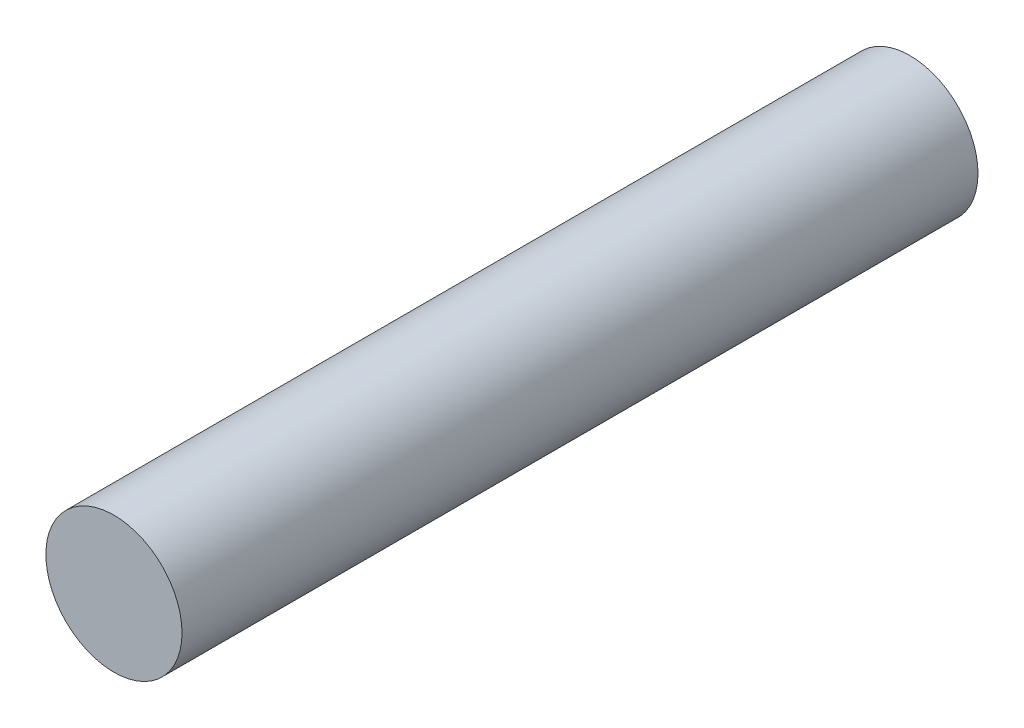
ISO-10303-21;
HEADER;
FILE_DESCRIPTION(('STEP AP214'),'2;1');
FILE_NAME('part.step','',(''),(''),'','','');
FILE_SCHEMA(('AUTOMOTIVE_DESIGN { 1 0 10303 214 1 1 1 1 }'));
ENDSEC;
DATA;
#1=APPLICATION_CONTEXT('core data for automotive mechanical design processes');
#2=APPLICATION_PROTOCOL_DEFINITION('international standard','automotive_design',2000,#1);
#3=PRODUCT_CONTEXT('',#1,'mechanical');
#4=PRODUCT('Part','Part','',(#3));
#5=PRODUCT_RELATED_PRODUCT_CATEGORY('part','',(#4));
#6=PRODUCT_DEFINITION_FORMATION('','',#4);
#7=PRODUCT_DEFINITION_CONTEXT('part definition',#1,'design');
#8=PRODUCT_DEFINITION('design','',#6,#7);
#9=PRODUCT_DEFINITION_SHAPE('','',#8);
#10=(LENGTH_UNIT() NAMED_UNIT(*) SI_UNIT(.MILLI.,.METRE.));
#11=(NAMED_UNIT(*) PLANE_ANGLE_UNIT() SI_UNIT($,.RADIAN.));
#12=(NAMED_UNIT(*) SI_UNIT($,.STERADIAN.) SOLID_ANGLE_UNIT());
#13=UNCERTAINTY_MEASURE_WITH_UNIT(LENGTH_MEASURE(1.E-05),#10,'distance_accuracy_value','');
#14=(GEOMETRIC_REPRESENTATION_CONTEXT(3) GLOBAL_UNCERTAINTY_ASSIGNED_CONTEXT((#13)) GLOBAL_UNIT_ASSIGNED_CONTEXT((#10,
#11,#12)) REPRESENTATION_CONTEXT('',''));
#15=CARTESIAN_POINT('',(0.,0.,0.));
#16=DIRECTION('',(0.,0.,1.));
#17=DIRECTION('',(1.,0.,0.));
#18=AXIS2_PLACEMENT_3D('',#15,#16,#17);
#19=CARTESIAN_POINT('',(0.,0.,76.));
#20=DIRECTION('',(0.,0.,-1.));
#21=DIRECTION('',(-1.,0.,0.));
#22=AXIS2_PLACEMENT_3D('',#19,#20,#21);
#23=CYLINDRICAL_SURFACE('',#22,6.5);
#24=CARTESIAN_POINT('',(0.,0.,76.));
#25=DIRECTION('',(0.,0.,1.));
#26=DIRECTION('',(1.,0.,0.));
#27=AXIS2_PLACEMENT_3D('',#24,#25,#26);
#28=CIRCLE('',#27,6.5);
#29=CARTESIAN_POINT('',(6.5,0.,76.));
#30=VERTEX_POINT('',#29);
#31=EDGE_CURVE('E10',#30,#30,#28,.T.);
#32=ORIENTED_EDGE('',*,*,#31,.F.);
#33=EDGE_LOOP('',(#32));
#34=FACE_BOUND('',#33,.T.);
#35=CARTESIAN_POINT('',(0.,0.,0.));
#36=DIRECTION('',(0.,0.,1.));
#37=DIRECTION('',(1.,0.,0.));
#38=AXIS2_PLACEMENT_3D('',#35,#36,#37);
#39=CIRCLE('',#38,6.5);
#40=CARTESIAN_POINT('',(6.5,0.,0.));
#41=VERTEX_POINT('',#40);
#42=EDGE_CURVE('E40',#41,#41,#39,.T.);
#43=ORIENTED_EDGE('',*,*,#42,.T.);
#44=EDGE_LOOP('',(#43));
#45=FACE_BOUND('',#44,.T.);
#46=ADVANCED_FACE('F37',(#34,#45),#23,.T.);
#47=CARTESIAN_POINT('',(0.,0.,76.));
#48=DIRECTION('',(0.,0.,1.));
#49=DIRECTION('',(1.,0.,0.));
#50=AXIS2_PLACEMENT_3D('',#47,#48,#49);
#51=PLANE('',#50);
#52=ORIENTED_EDGE('',*,*,#31,.T.);
#53=EDGE_LOOP('',(#52));
#54=FACE_BOUND('',#53,.T.);
#55=ADVANCED_FACE('F54',(#54),#51,.T.);
#56=CARTESIAN_POINT('',(0.,0.,0.));
#57=DIRECTION('',(0.,0.,1.));
#58=DIRECTION('',(1.,0.,0.));
#59=AXIS2_PLACEMENT_3D('',#56,#57,#58);
#60=PLANE('',#59);
#61=ORIENTED_EDGE('',*,*,#42,.F.);
#62=EDGE_LOOP('',(#61));
#63=FACE_BOUND('',#62,.T.);
#64=ADVANCED_FACE('F52',(#63),#60,.F.);
#65=CLOSED_SHELL('',(#46,#55,#64));
#66=MANIFOLD_SOLID_BREP('B2',#65);
#67=ADVANCED_BREP_SHAPE_REPRESENTATION('',(#18,#66),#14);
#68=SHAPE_DEFINITION_REPRESENTATION(#9,#67);
ENDSEC;
END-ISO-10303-21;
